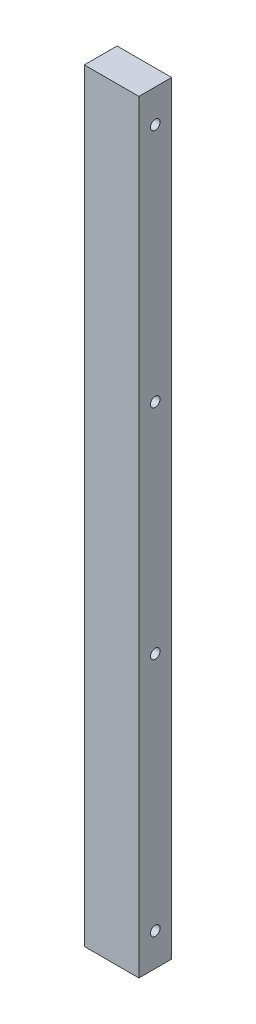
ISO-10303-21;
HEADER;
FILE_DESCRIPTION(('STEP AP214'),'2;1');
FILE_NAME('part.step','',(''),(''),'','','');
FILE_SCHEMA(('AUTOMOTIVE_DESIGN { 1 0 10303 214 1 1 1 1 }'));
ENDSEC;
DATA;
#1=APPLICATION_CONTEXT('core data for automotive mechanical design processes');
#2=APPLICATION_PROTOCOL_DEFINITION('international standard','automotive_design',2000,#1);
#3=PRODUCT_CONTEXT('',#1,'mechanical');
#4=PRODUCT('Part','Part','',(#3));
#5=PRODUCT_RELATED_PRODUCT_CATEGORY('part','',(#4));
#6=PRODUCT_DEFINITION_FORMATION('','',#4);
#7=PRODUCT_DEFINITION_CONTEXT('part definition',#1,'design');
#8=PRODUCT_DEFINITION('design','',#6,#7);
#9=PRODUCT_DEFINITION_SHAPE('','',#8);
#10=(LENGTH_UNIT() NAMED_UNIT(*) SI_UNIT(.MILLI.,.METRE.));
#11=(NAMED_UNIT(*) PLANE_ANGLE_UNIT() SI_UNIT($,.RADIAN.));
#12=(NAMED_UNIT(*) SI_UNIT($,.STERADIAN.) SOLID_ANGLE_UNIT());
#13=UNCERTAINTY_MEASURE_WITH_UNIT(LENGTH_MEASURE(1.E-05),#10,'distance_accuracy_value','');
#14=(GEOMETRIC_REPRESENTATION_CONTEXT(3) GLOBAL_UNCERTAINTY_ASSIGNED_CONTEXT((#13)) GLOBAL_UNIT_ASSIGNED_CONTEXT((#10,
#11,#12)) REPRESENTATION_CONTEXT('',''));
#15=CARTESIAN_POINT('',(0.,0.,0.));
#16=DIRECTION('',(0.,0.,1.));
#17=DIRECTION('',(1.,0.,0.));
#18=AXIS2_PLACEMENT_3D('',#15,#16,#17);
#19=CARTESIAN_POINT('',(0.,700.,-30.));
#20=DIRECTION('',(1.,0.,0.));
#21=DIRECTION('',(0.,0.,-1.));
#22=AXIS2_PLACEMENT_3D('',#19,#20,#21);
#23=PLANE('',#22);
#24=CARTESIAN_POINT('',(0.,670.,-15.));
#25=DIRECTION('',(1.,0.,0.));
#26=DIRECTION('',(0.,0.,-1.));
#27=AXIS2_PLACEMENT_3D('',#24,#25,#26);
#28=CIRCLE('',#27,4.39999999999996);
#29=CARTESIAN_POINT('',(0.,670.,-19.4));
#30=VERTEX_POINT('',#29);
#31=EDGE_CURVE('E121',#30,#30,#28,.T.);
#32=ORIENTED_EDGE('',*,*,#31,.F.);
#33=EDGE_LOOP('',(#32));
#34=FACE_BOUND('',#33,.T.);
#35=CARTESIAN_POINT('',(0.,450.,-15.));
#36=DIRECTION('',(1.,0.,0.));
#37=DIRECTION('',(0.,0.,-1.));
#38=AXIS2_PLACEMENT_3D('',#35,#36,#37);
#39=CIRCLE('',#38,4.40000000000001);
#40=CARTESIAN_POINT('',(0.,450.,-19.4));
#41=VERTEX_POINT('',#40);
#42=EDGE_CURVE('E127',#41,#41,#39,.T.);
#43=ORIENTED_EDGE('',*,*,#42,.F.);
#44=EDGE_LOOP('',(#43));
#45=FACE_BOUND('',#44,.T.);
#46=CARTESIAN_POINT('',(0.,250.,-15.));
#47=DIRECTION('',(1.,0.,0.));
#48=DIRECTION('',(0.,0.,-1.));
#49=AXIS2_PLACEMENT_3D('',#46,#47,#48);
#50=CIRCLE('',#49,4.40000000000001);
#51=CARTESIAN_POINT('',(0.,250.,-19.4));
#52=VERTEX_POINT('',#51);
#53=EDGE_CURVE('E133',#52,#52,#50,.T.);
#54=ORIENTED_EDGE('',*,*,#53,.F.);
#55=EDGE_LOOP('',(#54));
#56=FACE_BOUND('',#55,.T.);
#57=CARTESIAN_POINT('',(0.,30.,-15.));
#58=DIRECTION('',(1.,0.,0.));
#59=DIRECTION('',(0.,0.,-1.));
#60=AXIS2_PLACEMENT_3D('',#57,#58,#59);
#61=CIRCLE('',#60,4.4);
#62=CARTESIAN_POINT('',(0.,30.,-19.4));
#63=VERTEX_POINT('',#62);
#64=EDGE_CURVE('E139',#63,#63,#61,.T.);
#65=ORIENTED_EDGE('',*,*,#64,.F.);
#66=EDGE_LOOP('',(#65));
#67=FACE_BOUND('',#66,.T.);
#68=DIRECTION('',(0.,1.,0.));
#69=VECTOR('',#68,1.);
#70=CARTESIAN_POINT('',(0.,700.,0.));
#71=LINE('',#70,#69);
#72=CARTESIAN_POINT('',(0.,0.,0.));
#73=VERTEX_POINT('',#72);
#74=CARTESIAN_POINT('',(0.,700.,0.));
#75=VERTEX_POINT('',#74);
#76=EDGE_CURVE('E145',#73,#75,#71,.T.);
#77=ORIENTED_EDGE('',*,*,#76,.F.);
#78=DIRECTION('',(0.,0.,1.));
#79=VECTOR('',#78,1.);
#80=CARTESIAN_POINT('',(0.,0.,-30.));
#81=LINE('',#80,#79);
#82=CARTESIAN_POINT('',(0.,0.,-30.));
#83=VERTEX_POINT('',#82);
#84=EDGE_CURVE('E11',#83,#73,#81,.T.);
#85=ORIENTED_EDGE('',*,*,#84,.F.);
#86=DIRECTION('',(0.,1.,0.));
#87=VECTOR('',#86,1.);
#88=CARTESIAN_POINT('',(0.,700.,-30.));
#89=LINE('',#88,#87);
#90=CARTESIAN_POINT('',(0.,700.,-30.));
#91=VERTEX_POINT('',#90);
#92=EDGE_CURVE('E146',#83,#91,#89,.T.);
#93=ORIENTED_EDGE('',*,*,#92,.T.);
#94=DIRECTION('',(0.,0.,1.));
#95=VECTOR('',#94,1.);
#96=CARTESIAN_POINT('',(0.,700.,-30.));
#97=LINE('',#96,#95);
#98=EDGE_CURVE('E39',#91,#75,#97,.T.);
#99=ORIENTED_EDGE('',*,*,#98,.T.);
#100=EDGE_LOOP('',(#77,#85,#93,#99));
#101=FACE_BOUND('',#100,.T.);
#102=ADVANCED_FACE('F36',(#34,#45,#56,#67,#101),#23,.T.);
#103=CARTESIAN_POINT('',(0.,0.,-30.));
#104=DIRECTION('',(0.,-1.,0.));
#105=DIRECTION('',(0.,0.,-1.));
#106=AXIS2_PLACEMENT_3D('',#103,#104,#105);
#107=PLANE('',#106);
#108=DIRECTION('',(1.,0.,0.));
#109=VECTOR('',#108,1.);
#110=CARTESIAN_POINT('',(0.,0.,0.));
#111=LINE('',#110,#109);
#112=CARTESIAN_POINT('',(-50.,0.,0.));
#113=VERTEX_POINT('',#112);
#114=EDGE_CURVE('E149',#113,#73,#111,.T.);
#115=ORIENTED_EDGE('',*,*,#114,.F.);
#116=DIRECTION('',(0.,0.,1.));
#117=VECTOR('',#116,1.);
#118=CARTESIAN_POINT('',(-50.,0.,-30.));
#119=LINE('',#118,#117);
#120=CARTESIAN_POINT('',(-50.,0.,-30.));
#121=VERTEX_POINT('',#120);
#122=EDGE_CURVE('E45',#121,#113,#119,.T.);
#123=ORIENTED_EDGE('',*,*,#122,.F.);
#124=DIRECTION('',(1.,0.,0.));
#125=VECTOR('',#124,1.);
#126=CARTESIAN_POINT('',(0.,0.,-30.));
#127=LINE('',#126,#125);
#128=EDGE_CURVE('E153',#121,#83,#127,.T.);
#129=ORIENTED_EDGE('',*,*,#128,.T.);
#130=ORIENTED_EDGE('',*,*,#84,.T.);
#131=EDGE_LOOP('',(#115,#123,#129,#130));
#132=FACE_BOUND('',#131,.T.);
#133=ADVANCED_FACE('F168',(#132),#107,.T.);
#134=CARTESIAN_POINT('',(-50.,700.,-30.));
#135=DIRECTION('',(-1.,0.,0.));
#136=DIRECTION('',(0.,0.,1.));
#137=AXIS2_PLACEMENT_3D('',#134,#135,#136);
#138=PLANE('',#137);
#139=CARTESIAN_POINT('',(-50.,535.000000000003,-15.));
#140=DIRECTION('',(-1.,0.,0.));
#141=DIRECTION('',(0.,0.,1.));
#142=AXIS2_PLACEMENT_3D('',#139,#140,#141);
#143=CIRCLE('',#142,5.24999999999998);
#144=CARTESIAN_POINT('',(-50.,535.000000000003,-9.75000000000004));
#145=VERTEX_POINT('',#144);
#146=EDGE_CURVE('E111',#145,#145,#143,.T.);
#147=ORIENTED_EDGE('',*,*,#146,.F.);
#148=EDGE_LOOP('',(#147));
#149=FACE_BOUND('',#148,.T.);
#150=CARTESIAN_POINT('',(-50.,135.000000000003,-15.));
#151=DIRECTION('',(-1.,0.,0.));
#152=DIRECTION('',(0.,0.,1.));
#153=AXIS2_PLACEMENT_3D('',#150,#151,#152);
#154=CIRCLE('',#153,5.25);
#155=CARTESIAN_POINT('',(-50.,135.000000000003,-9.75000000000001));
#156=VERTEX_POINT('',#155);
#157=EDGE_CURVE('E110',#156,#156,#154,.T.);
#158=ORIENTED_EDGE('',*,*,#157,.F.);
#159=EDGE_LOOP('',(#158));
#160=FACE_BOUND('',#159,.T.);
#161=DIRECTION('',(0.,-1.,0.));
#162=VECTOR('',#161,1.);
#163=CARTESIAN_POINT('',(-50.,700.,0.));
#164=LINE('',#163,#162);
#165=CARTESIAN_POINT('',(-50.,700.,0.));
#166=VERTEX_POINT('',#165);
#167=EDGE_CURVE('E160',#166,#113,#164,.T.);
#168=ORIENTED_EDGE('',*,*,#167,.F.);
#169=DIRECTION('',(0.,0.,1.));
#170=VECTOR('',#169,1.);
#171=CARTESIAN_POINT('',(-50.,700.,-30.));
#172=LINE('',#171,#170);
#173=CARTESIAN_POINT('',(-50.,700.,-30.));
#174=VERTEX_POINT('',#173);
#175=EDGE_CURVE('E164',#174,#166,#172,.T.);
#176=ORIENTED_EDGE('',*,*,#175,.F.);
#177=DIRECTION('',(0.,-1.,0.));
#178=VECTOR('',#177,1.);
#179=CARTESIAN_POINT('',(-50.,700.,-30.));
#180=LINE('',#179,#178);
#181=EDGE_CURVE('E151',#174,#121,#180,.T.);
#182=ORIENTED_EDGE('',*,*,#181,.T.);
#183=ORIENTED_EDGE('',*,*,#122,.T.);
#184=EDGE_LOOP('',(#168,#176,#182,#183));
#185=FACE_BOUND('',#184,.T.);
#186=ADVANCED_FACE('F171',(#149,#160,#185),#138,.T.);
#187=CARTESIAN_POINT('',(0.,700.,-30.));
#188=DIRECTION('',(0.,1.,0.));
#189=DIRECTION('',(0.,0.,1.));
#190=AXIS2_PLACEMENT_3D('',#187,#188,#189);
#191=PLANE('',#190);
#192=DIRECTION('',(-1.,0.,0.));
#193=VECTOR('',#192,1.);
#194=CARTESIAN_POINT('',(0.,700.,0.));
#195=LINE('',#194,#193);
#196=EDGE_CURVE('E157',#75,#166,#195,.T.);
#197=ORIENTED_EDGE('',*,*,#196,.F.);
#198=ORIENTED_EDGE('',*,*,#98,.F.);
#199=DIRECTION('',(-1.,0.,0.));
#200=VECTOR('',#199,1.);
#201=CARTESIAN_POINT('',(0.,700.,-30.));
#202=LINE('',#201,#200);
#203=EDGE_CURVE('E148',#91,#174,#202,.T.);
#204=ORIENTED_EDGE('',*,*,#203,.T.);
#205=ORIENTED_EDGE('',*,*,#175,.T.);
#206=EDGE_LOOP('',(#197,#198,#204,#205));
#207=FACE_BOUND('',#206,.T.);
#208=ADVANCED_FACE('F165',(#207),#191,.T.);
#209=CARTESIAN_POINT('',(0.,0.,-30.));
#210=DIRECTION('',(0.,0.,-1.));
#211=DIRECTION('',(-1.,0.,0.));
#212=AXIS2_PLACEMENT_3D('',#209,#210,#211);
#213=PLANE('',#212);
#214=ORIENTED_EDGE('',*,*,#92,.F.);
#215=ORIENTED_EDGE('',*,*,#128,.F.);
#216=ORIENTED_EDGE('',*,*,#181,.F.);
#217=ORIENTED_EDGE('',*,*,#203,.F.);
#218=EDGE_LOOP('',(#214,#215,#216,#217));
#219=FACE_BOUND('',#218,.T.);
#220=ADVANCED_FACE('F173',(#219),#213,.T.);
#221=CARTESIAN_POINT('',(0.,0.,0.));
#222=DIRECTION('',(0.,0.,-1.));
#223=DIRECTION('',(-1.,0.,0.));
#224=AXIS2_PLACEMENT_3D('',#221,#222,#223);
#225=PLANE('',#224);
#226=ORIENTED_EDGE('',*,*,#76,.T.);
#227=ORIENTED_EDGE('',*,*,#196,.T.);
#228=ORIENTED_EDGE('',*,*,#167,.T.);
#229=ORIENTED_EDGE('',*,*,#114,.T.);
#230=EDGE_LOOP('',(#226,#227,#228,#229));
#231=FACE_BOUND('',#230,.T.);
#232=ADVANCED_FACE('F167',(#231),#225,.F.);
#233=CARTESIAN_POINT('',(-23.75,30.,-15.));
#234=DIRECTION('',(1.,0.,0.));
#235=DIRECTION('',(0.,0.,-1.));
#236=AXIS2_PLACEMENT_3D('',#233,#234,#235);
#237=CONICAL_SURFACE('',#236,4.4,1.02974425867665);
#238=CARTESIAN_POINT('',(-26.3937867237213,30.,-15.));
#239=VERTEX_POINT('',#238);
#240=VERTEX_LOOP('',#239);
#241=FACE_BOUND('',#240,.T.);
#242=CARTESIAN_POINT('',(-23.75,30.,-15.));
#243=DIRECTION('',(1.,0.,0.));
#244=DIRECTION('',(0.,0.,-1.));
#245=AXIS2_PLACEMENT_3D('',#242,#243,#244);
#246=CIRCLE('',#245,4.4);
#247=CARTESIAN_POINT('',(-23.75,30.,-19.4));
#248=VERTEX_POINT('',#247);
#249=EDGE_CURVE('E142',#248,#248,#246,.T.);
#250=ORIENTED_EDGE('',*,*,#249,.T.);
#251=EDGE_LOOP('',(#250));
#252=FACE_BOUND('',#251,.T.);
#253=ADVANCED_FACE('F180',(#241,#252),#237,.F.);
#254=CARTESIAN_POINT('',(0.,30.,-15.));
#255=DIRECTION('',(1.,0.,0.));
#256=DIRECTION('',(0.,0.,-1.));
#257=AXIS2_PLACEMENT_3D('',#254,#255,#256);
#258=CYLINDRICAL_SURFACE('',#257,4.4);
#259=ORIENTED_EDGE('',*,*,#249,.F.);
#260=EDGE_LOOP('',(#259));
#261=FACE_BOUND('',#260,.T.);
#262=ORIENTED_EDGE('',*,*,#64,.T.);
#263=EDGE_LOOP('',(#262));
#264=FACE_BOUND('',#263,.T.);
#265=ADVANCED_FACE('F197',(#261,#264),#258,.F.);
#266=CARTESIAN_POINT('',(-23.75,250.,-15.));
#267=DIRECTION('',(1.,0.,0.));
#268=DIRECTION('',(0.,0.,-1.));
#269=AXIS2_PLACEMENT_3D('',#266,#267,#268);
#270=CONICAL_SURFACE('',#269,4.40000000000001,1.02974425867665);
#271=CARTESIAN_POINT('',(-26.3937867237213,250.,-15.));
#272=VERTEX_POINT('',#271);
#273=VERTEX_LOOP('',#272);
#274=FACE_BOUND('',#273,.T.);
#275=CARTESIAN_POINT('',(-23.75,250.,-15.));
#276=DIRECTION('',(1.,0.,0.));
#277=DIRECTION('',(0.,0.,-1.));
#278=AXIS2_PLACEMENT_3D('',#275,#276,#277);
#279=CIRCLE('',#278,4.40000000000001);
#280=CARTESIAN_POINT('',(-23.75,250.,-19.4));
#281=VERTEX_POINT('',#280);
#282=EDGE_CURVE('E136',#281,#281,#279,.T.);
#283=ORIENTED_EDGE('',*,*,#282,.T.);
#284=EDGE_LOOP('',(#283));
#285=FACE_BOUND('',#284,.T.);
#286=ADVANCED_FACE('F199',(#274,#285),#270,.F.);
#287=CARTESIAN_POINT('',(0.,250.,-15.));
#288=DIRECTION('',(1.,0.,0.));
#289=DIRECTION('',(0.,0.,-1.));
#290=AXIS2_PLACEMENT_3D('',#287,#288,#289);
#291=CYLINDRICAL_SURFACE('',#290,4.40000000000001);
#292=ORIENTED_EDGE('',*,*,#282,.F.);
#293=EDGE_LOOP('',(#292));
#294=FACE_BOUND('',#293,.T.);
#295=ORIENTED_EDGE('',*,*,#53,.T.);
#296=EDGE_LOOP('',(#295));
#297=FACE_BOUND('',#296,.T.);
#298=ADVANCED_FACE('F206',(#294,#297),#291,.F.);
#299=CARTESIAN_POINT('',(-23.75,450.,-15.));
#300=DIRECTION('',(1.,0.,0.));
#301=DIRECTION('',(0.,0.,-1.));
#302=AXIS2_PLACEMENT_3D('',#299,#300,#301);
#303=CONICAL_SURFACE('',#302,4.40000000000001,1.02974425867665);
#304=CARTESIAN_POINT('',(-26.3937867237213,450.,-15.));
#305=VERTEX_POINT('',#304);
#306=VERTEX_LOOP('',#305);
#307=FACE_BOUND('',#306,.T.);
#308=CARTESIAN_POINT('',(-23.75,450.,-15.));
#309=DIRECTION('',(1.,0.,0.));
#310=DIRECTION('',(0.,0.,-1.));
#311=AXIS2_PLACEMENT_3D('',#308,#309,#310);
#312=CIRCLE('',#311,4.40000000000001);
#313=CARTESIAN_POINT('',(-23.75,450.,-19.4));
#314=VERTEX_POINT('',#313);
#315=EDGE_CURVE('E130',#314,#314,#312,.T.);
#316=ORIENTED_EDGE('',*,*,#315,.T.);
#317=EDGE_LOOP('',(#316));
#318=FACE_BOUND('',#317,.T.);
#319=ADVANCED_FACE('F214',(#307,#318),#303,.F.);
#320=CARTESIAN_POINT('',(0.,450.,-15.));
#321=DIRECTION('',(1.,0.,0.));
#322=DIRECTION('',(0.,0.,-1.));
#323=AXIS2_PLACEMENT_3D('',#320,#321,#322);
#324=CYLINDRICAL_SURFACE('',#323,4.40000000000001);
#325=ORIENTED_EDGE('',*,*,#315,.F.);
#326=EDGE_LOOP('',(#325));
#327=FACE_BOUND('',#326,.T.);
#328=ORIENTED_EDGE('',*,*,#42,.T.);
#329=EDGE_LOOP('',(#328));
#330=FACE_BOUND('',#329,.T.);
#331=ADVANCED_FACE('F218',(#327,#330),#324,.F.);
#332=CARTESIAN_POINT('',(-23.75,670.,-15.));
#333=DIRECTION('',(1.,0.,0.));
#334=DIRECTION('',(0.,0.,-1.));
#335=AXIS2_PLACEMENT_3D('',#332,#333,#334);
#336=CONICAL_SURFACE('',#335,4.39999999999996,1.02974425867665);
#337=CARTESIAN_POINT('',(-26.3937867237213,670.,-15.));
#338=VERTEX_POINT('',#337);
#339=VERTEX_LOOP('',#338);
#340=FACE_BOUND('',#339,.T.);
#341=CARTESIAN_POINT('',(-23.75,670.,-15.));
#342=DIRECTION('',(1.,0.,0.));
#343=DIRECTION('',(0.,0.,-1.));
#344=AXIS2_PLACEMENT_3D('',#341,#342,#343);
#345=CIRCLE('',#344,4.39999999999996);
#346=CARTESIAN_POINT('',(-23.75,670.,-19.4));
#347=VERTEX_POINT('',#346);
#348=EDGE_CURVE('E124',#347,#347,#345,.T.);
#349=ORIENTED_EDGE('',*,*,#348,.T.);
#350=EDGE_LOOP('',(#349));
#351=FACE_BOUND('',#350,.T.);
#352=ADVANCED_FACE('F222',(#340,#351),#336,.F.);
#353=CARTESIAN_POINT('',(0.,670.,-15.));
#354=DIRECTION('',(1.,0.,0.));
#355=DIRECTION('',(0.,0.,-1.));
#356=AXIS2_PLACEMENT_3D('',#353,#354,#355);
#357=CYLINDRICAL_SURFACE('',#356,4.39999999999996);
#358=ORIENTED_EDGE('',*,*,#348,.F.);
#359=EDGE_LOOP('',(#358));
#360=FACE_BOUND('',#359,.T.);
#361=ORIENTED_EDGE('',*,*,#31,.T.);
#362=EDGE_LOOP('',(#361));
#363=FACE_BOUND('',#362,.T.);
#364=ADVANCED_FACE('F226',(#360,#363),#357,.F.);
#365=CARTESIAN_POINT('',(-21.5,135.000000000003,-15.));
#366=DIRECTION('',(-1.,0.,0.));
#367=DIRECTION('',(0.,0.,1.));
#368=AXIS2_PLACEMENT_3D('',#365,#366,#367);
#369=CONICAL_SURFACE('',#368,5.25,1.02974425867665);
#370=CARTESIAN_POINT('',(-18.3454817501053,135.000000000003,-15.));
#371=VERTEX_POINT('',#370);
#372=VERTEX_LOOP('',#371);
#373=FACE_BOUND('',#372,.T.);
#374=CARTESIAN_POINT('',(-21.5,135.000000000003,-15.));
#375=DIRECTION('',(-1.,0.,0.));
#376=DIRECTION('',(0.,0.,1.));
#377=AXIS2_PLACEMENT_3D('',#374,#375,#376);
#378=CIRCLE('',#377,5.25);
#379=CARTESIAN_POINT('',(-21.5,135.000000000003,-9.75000000000001));
#380=VERTEX_POINT('',#379);
#381=EDGE_CURVE('E114',#380,#380,#378,.T.);
#382=ORIENTED_EDGE('',*,*,#381,.T.);
#383=EDGE_LOOP('',(#382));
#384=FACE_BOUND('',#383,.T.);
#385=ADVANCED_FACE('F230',(#373,#384),#369,.F.);
#386=CARTESIAN_POINT('',(-50.,135.000000000003,-15.));
#387=DIRECTION('',(-1.,0.,0.));
#388=DIRECTION('',(0.,0.,1.));
#389=AXIS2_PLACEMENT_3D('',#386,#387,#388);
#390=CYLINDRICAL_SURFACE('',#389,5.25);
#391=ORIENTED_EDGE('',*,*,#381,.F.);
#392=EDGE_LOOP('',(#391));
#393=FACE_BOUND('',#392,.T.);
#394=ORIENTED_EDGE('',*,*,#157,.T.);
#395=EDGE_LOOP('',(#394));
#396=FACE_BOUND('',#395,.T.);
#397=ADVANCED_FACE('F104',(#393,#396),#390,.F.);
#398=CARTESIAN_POINT('',(-21.5,535.000000000003,-15.));
#399=DIRECTION('',(-1.,0.,0.));
#400=DIRECTION('',(0.,0.,1.));
#401=AXIS2_PLACEMENT_3D('',#398,#399,#400);
#402=CONICAL_SURFACE('',#401,5.24999999999998,1.02974425867665);
#403=CARTESIAN_POINT('',(-18.3454817501053,535.000000000003,-15.));
#404=VERTEX_POINT('',#403);
#405=VERTEX_LOOP('',#404);
#406=FACE_BOUND('',#405,.T.);
#407=CARTESIAN_POINT('',(-21.5,535.000000000003,-15.));
#408=DIRECTION('',(-1.,0.,0.));
#409=DIRECTION('',(0.,0.,1.));
#410=AXIS2_PLACEMENT_3D('',#407,#408,#409);
#411=CIRCLE('',#410,5.24999999999998);
#412=CARTESIAN_POINT('',(-21.5,535.000000000003,-9.75000000000004));
#413=VERTEX_POINT('',#412);
#414=EDGE_CURVE('E108',#413,#413,#411,.T.);
#415=ORIENTED_EDGE('',*,*,#414,.T.);
#416=EDGE_LOOP('',(#415));
#417=FACE_BOUND('',#416,.T.);
#418=ADVANCED_FACE('F100',(#406,#417),#402,.F.);
#419=CARTESIAN_POINT('',(-50.,535.000000000003,-15.));
#420=DIRECTION('',(-1.,0.,0.));
#421=DIRECTION('',(0.,0.,1.));
#422=AXIS2_PLACEMENT_3D('',#419,#420,#421);
#423=CYLINDRICAL_SURFACE('',#422,5.24999999999998);
#424=ORIENTED_EDGE('',*,*,#414,.F.);
#425=EDGE_LOOP('',(#424));
#426=FACE_BOUND('',#425,.T.);
#427=ORIENTED_EDGE('',*,*,#146,.T.);
#428=EDGE_LOOP('',(#427));
#429=FACE_BOUND('',#428,.T.);
#430=ADVANCED_FACE('F103',(#426,#429),#423,.F.);
#431=CLOSED_SHELL('',(#102,#133,#186,#208,#220,#232,#253,#265,#286,#298,#319,#331,#352,#364,
#385,#397,#418,#430));
#432=MANIFOLD_SOLID_BREP('B2',#431);
#433=ADVANCED_BREP_SHAPE_REPRESENTATION('',(#18,#432),#14);
#434=SHAPE_DEFINITION_REPRESENTATION(#9,#433);
ENDSEC;
END-ISO-10303-21;
